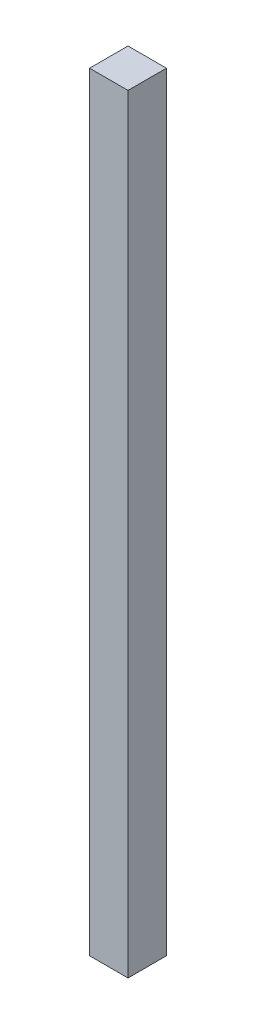
ISO-10303-21;
HEADER;
FILE_DESCRIPTION(('STEP AP214'),'2;1');
FILE_NAME('part.step','',(''),(''),'','','');
FILE_SCHEMA(('AUTOMOTIVE_DESIGN { 1 0 10303 214 1 1 1 1 }'));
ENDSEC;
DATA;
#1=APPLICATION_CONTEXT('core data for automotive mechanical design processes');
#2=APPLICATION_PROTOCOL_DEFINITION('international standard','automotive_design',2000,#1);
#3=PRODUCT_CONTEXT('',#1,'mechanical');
#4=PRODUCT('Part','Part','',(#3));
#5=PRODUCT_RELATED_PRODUCT_CATEGORY('part','',(#4));
#6=PRODUCT_DEFINITION_FORMATION('','',#4);
#7=PRODUCT_DEFINITION_CONTEXT('part definition',#1,'design');
#8=PRODUCT_DEFINITION('design','',#6,#7);
#9=PRODUCT_DEFINITION_SHAPE('','',#8);
#10=(LENGTH_UNIT() NAMED_UNIT(*) SI_UNIT(.MILLI.,.METRE.));
#11=(NAMED_UNIT(*) PLANE_ANGLE_UNIT() SI_UNIT($,.RADIAN.));
#12=(NAMED_UNIT(*) SI_UNIT($,.STERADIAN.) SOLID_ANGLE_UNIT());
#13=UNCERTAINTY_MEASURE_WITH_UNIT(LENGTH_MEASURE(1.E-05),#10,'distance_accuracy_value','');
#14=(GEOMETRIC_REPRESENTATION_CONTEXT(3) GLOBAL_UNCERTAINTY_ASSIGNED_CONTEXT((#13)) GLOBAL_UNIT_ASSIGNED_CONTEXT((#10,
#11,#12)) REPRESENTATION_CONTEXT('',''));
#15=CARTESIAN_POINT('',(0.,0.,0.));
#16=DIRECTION('',(0.,0.,1.));
#17=DIRECTION('',(1.,0.,0.));
#18=AXIS2_PLACEMENT_3D('',#15,#16,#17);
#19=CARTESIAN_POINT('',(10.,-200.,10.));
#20=DIRECTION('',(1.,0.,0.));
#21=DIRECTION('',(0.,0.,-1.));
#22=AXIS2_PLACEMENT_3D('',#19,#20,#21);
#23=PLANE('',#22);
#24=DIRECTION('',(0.,1.,0.));
#25=VECTOR('',#24,1.);
#26=CARTESIAN_POINT('',(10.,-200.,-10.));
#27=LINE('',#26,#25);
#28=CARTESIAN_POINT('',(10.,-200.,-10.));
#29=VERTEX_POINT('',#28);
#30=CARTESIAN_POINT('',(10.,200.,-10.));
#31=VERTEX_POINT('',#30);
#32=EDGE_CURVE('E45',#29,#31,#27,.T.);
#33=ORIENTED_EDGE('',*,*,#32,.T.);
#34=DIRECTION('',(0.,0.,-1.));
#35=VECTOR('',#34,1.);
#36=CARTESIAN_POINT('',(10.,200.,10.));
#37=LINE('',#36,#35);
#38=CARTESIAN_POINT('',(10.,200.,10.));
#39=VERTEX_POINT('',#38);
#40=EDGE_CURVE('E83',#39,#31,#37,.T.);
#41=ORIENTED_EDGE('',*,*,#40,.F.);
#42=DIRECTION('',(0.,1.,0.));
#43=VECTOR('',#42,1.);
#44=CARTESIAN_POINT('',(10.,-200.,10.));
#45=LINE('',#44,#43);
#46=CARTESIAN_POINT('',(10.,-200.,10.));
#47=VERTEX_POINT('',#46);
#48=EDGE_CURVE('E11',#47,#39,#45,.T.);
#49=ORIENTED_EDGE('',*,*,#48,.F.);
#50=DIRECTION('',(0.,0.,-1.));
#51=VECTOR('',#50,1.);
#52=CARTESIAN_POINT('',(10.,-200.,10.));
#53=LINE('',#52,#51);
#54=EDGE_CURVE('E84',#47,#29,#53,.T.);
#55=ORIENTED_EDGE('',*,*,#54,.T.);
#56=EDGE_LOOP('',(#33,#41,#49,#55));
#57=FACE_BOUND('',#56,.T.);
#58=ADVANCED_FACE('F42',(#57),#23,.T.);
#59=CARTESIAN_POINT('',(-10.,-200.,10.));
#60=DIRECTION('',(0.,0.,1.));
#61=DIRECTION('',(1.,0.,0.));
#62=AXIS2_PLACEMENT_3D('',#59,#60,#61);
#63=PLANE('',#62);
#64=ORIENTED_EDGE('',*,*,#48,.T.);
#65=DIRECTION('',(1.,0.,0.));
#66=VECTOR('',#65,1.);
#67=CARTESIAN_POINT('',(-10.,200.,10.));
#68=LINE('',#67,#66);
#69=CARTESIAN_POINT('',(-10.,200.,10.));
#70=VERTEX_POINT('',#69);
#71=EDGE_CURVE('E102',#70,#39,#68,.T.);
#72=ORIENTED_EDGE('',*,*,#71,.F.);
#73=DIRECTION('',(0.,1.,0.));
#74=VECTOR('',#73,1.);
#75=CARTESIAN_POINT('',(-10.,-200.,10.));
#76=LINE('',#75,#74);
#77=CARTESIAN_POINT('',(-10.,-200.,10.));
#78=VERTEX_POINT('',#77);
#79=EDGE_CURVE('E51',#78,#70,#76,.T.);
#80=ORIENTED_EDGE('',*,*,#79,.F.);
#81=DIRECTION('',(1.,0.,0.));
#82=VECTOR('',#81,1.);
#83=CARTESIAN_POINT('',(-10.,-200.,10.));
#84=LINE('',#83,#82);
#85=EDGE_CURVE('E90',#78,#47,#84,.T.);
#86=ORIENTED_EDGE('',*,*,#85,.T.);
#87=EDGE_LOOP('',(#64,#72,#80,#86));
#88=FACE_BOUND('',#87,.T.);
#89=ADVANCED_FACE('F126',(#88),#63,.T.);
#90=CARTESIAN_POINT('',(-10.,-200.,10.));
#91=DIRECTION('',(-1.,0.,0.));
#92=DIRECTION('',(0.,0.,1.));
#93=AXIS2_PLACEMENT_3D('',#90,#91,#92);
#94=PLANE('',#93);
#95=ORIENTED_EDGE('',*,*,#79,.T.);
#96=DIRECTION('',(0.,0.,1.));
#97=VECTOR('',#96,1.);
#98=CARTESIAN_POINT('',(-10.,200.,10.));
#99=LINE('',#98,#97);
#100=CARTESIAN_POINT('',(-10.,200.,-10.));
#101=VERTEX_POINT('',#100);
#102=EDGE_CURVE('E98',#101,#70,#99,.T.);
#103=ORIENTED_EDGE('',*,*,#102,.F.);
#104=DIRECTION('',(0.,1.,0.));
#105=VECTOR('',#104,1.);
#106=CARTESIAN_POINT('',(-10.,-200.,-10.));
#107=LINE('',#106,#105);
#108=CARTESIAN_POINT('',(-10.,-200.,-10.));
#109=VERTEX_POINT('',#108);
#110=EDGE_CURVE('E89',#109,#101,#107,.T.);
#111=ORIENTED_EDGE('',*,*,#110,.F.);
#112=DIRECTION('',(0.,0.,1.));
#113=VECTOR('',#112,1.);
#114=CARTESIAN_POINT('',(-10.,-200.,10.));
#115=LINE('',#114,#113);
#116=EDGE_CURVE('E115',#109,#78,#115,.T.);
#117=ORIENTED_EDGE('',*,*,#116,.T.);
#118=EDGE_LOOP('',(#95,#103,#111,#117));
#119=FACE_BOUND('',#118,.T.);
#120=ADVANCED_FACE('F123',(#119),#94,.T.);
#121=CARTESIAN_POINT('',(-10.,-200.,-10.));
#122=DIRECTION('',(0.,0.,-1.));
#123=DIRECTION('',(-1.,0.,0.));
#124=AXIS2_PLACEMENT_3D('',#121,#122,#123);
#125=PLANE('',#124);
#126=ORIENTED_EDGE('',*,*,#110,.T.);
#127=DIRECTION('',(-1.,0.,0.));
#128=VECTOR('',#127,1.);
#129=CARTESIAN_POINT('',(-10.,200.,-10.));
#130=LINE('',#129,#128);
#131=EDGE_CURVE('E92',#31,#101,#130,.T.);
#132=ORIENTED_EDGE('',*,*,#131,.F.);
#133=ORIENTED_EDGE('',*,*,#32,.F.);
#134=DIRECTION('',(-1.,0.,0.));
#135=VECTOR('',#134,1.);
#136=CARTESIAN_POINT('',(-10.,-200.,-10.));
#137=LINE('',#136,#135);
#138=EDGE_CURVE('E112',#29,#109,#137,.T.);
#139=ORIENTED_EDGE('',*,*,#138,.T.);
#140=EDGE_LOOP('',(#126,#132,#133,#139));
#141=FACE_BOUND('',#140,.T.);
#142=ADVANCED_FACE('F93',(#141),#125,.T.);
#143=CARTESIAN_POINT('',(0.,-200.,0.));
#144=DIRECTION('',(0.,-1.,0.));
#145=DIRECTION('',(0.,0.,-1.));
#146=AXIS2_PLACEMENT_3D('',#143,#144,#145);
#147=PLANE('',#146);
#148=ORIENTED_EDGE('',*,*,#54,.F.);
#149=ORIENTED_EDGE('',*,*,#85,.F.);
#150=ORIENTED_EDGE('',*,*,#116,.F.);
#151=ORIENTED_EDGE('',*,*,#138,.F.);
#152=EDGE_LOOP('',(#148,#149,#150,#151));
#153=FACE_BOUND('',#152,.T.);
#154=ADVANCED_FACE('F128',(#153),#147,.T.);
#155=CARTESIAN_POINT('',(0.,200.,0.));
#156=DIRECTION('',(0.,-1.,0.));
#157=DIRECTION('',(0.,0.,-1.));
#158=AXIS2_PLACEMENT_3D('',#155,#156,#157);
#159=PLANE('',#158);
#160=ORIENTED_EDGE('',*,*,#40,.T.);
#161=ORIENTED_EDGE('',*,*,#131,.T.);
#162=ORIENTED_EDGE('',*,*,#102,.T.);
#163=ORIENTED_EDGE('',*,*,#71,.T.);
#164=EDGE_LOOP('',(#160,#161,#162,#163));
#165=FACE_BOUND('',#164,.T.);
#166=ADVANCED_FACE('F101',(#165),#159,.F.);
#167=CLOSED_SHELL('',(#58,#89,#120,#142,#154,#166));
#168=MANIFOLD_SOLID_BREP('B2',#167);
#169=ADVANCED_BREP_SHAPE_REPRESENTATION('',(#18,#168),#14);
#170=SHAPE_DEFINITION_REPRESENTATION(#9,#169);
ENDSEC;
END-ISO-10303-21;
